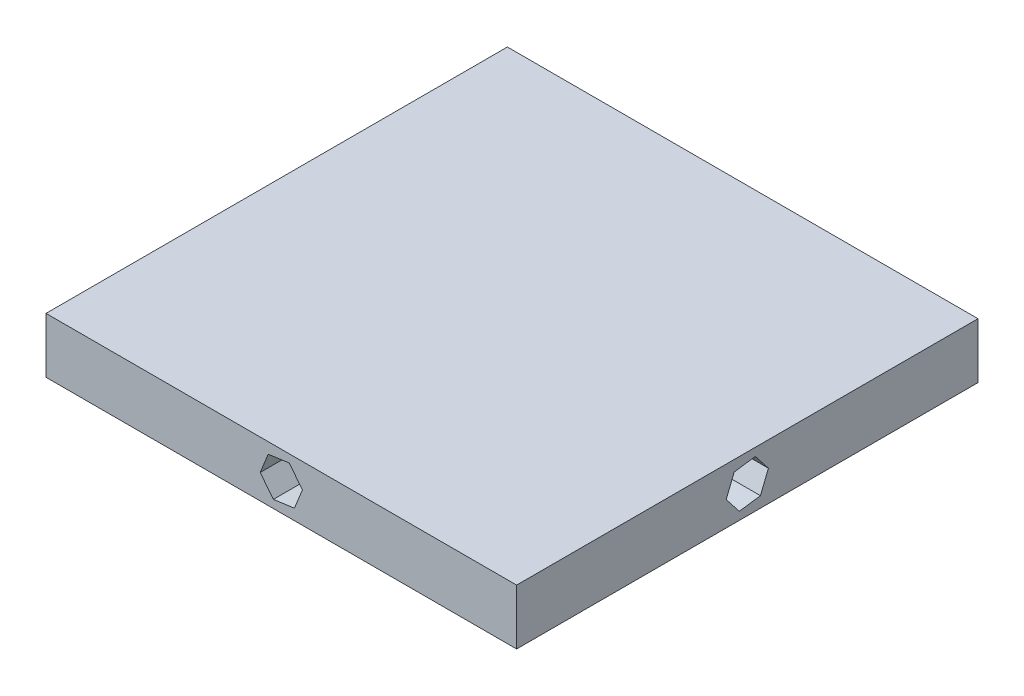
ISO-10303-21;
HEADER;
FILE_DESCRIPTION(('STEP AP214'),'2;1');
FILE_NAME('part.step','',(''),(''),'','','');
FILE_SCHEMA(('AUTOMOTIVE_DESIGN { 1 0 10303 214 1 1 1 1 }'));
ENDSEC;
DATA;
#1=APPLICATION_CONTEXT('core data for automotive mechanical design processes');
#2=APPLICATION_PROTOCOL_DEFINITION('international standard','automotive_design',2000,#1);
#3=PRODUCT_CONTEXT('',#1,'mechanical');
#4=PRODUCT('Part','Part','',(#3));
#5=PRODUCT_RELATED_PRODUCT_CATEGORY('part','',(#4));
#6=PRODUCT_DEFINITION_FORMATION('','',#4);
#7=PRODUCT_DEFINITION_CONTEXT('part definition',#1,'design');
#8=PRODUCT_DEFINITION('design','',#6,#7);
#9=PRODUCT_DEFINITION_SHAPE('','',#8);
#10=(LENGTH_UNIT() NAMED_UNIT(*) SI_UNIT(.MILLI.,.METRE.));
#11=(NAMED_UNIT(*) PLANE_ANGLE_UNIT() SI_UNIT($,.RADIAN.));
#12=(NAMED_UNIT(*) SI_UNIT($,.STERADIAN.) SOLID_ANGLE_UNIT());
#13=UNCERTAINTY_MEASURE_WITH_UNIT(LENGTH_MEASURE(1.E-05),#10,'distance_accuracy_value','');
#14=(GEOMETRIC_REPRESENTATION_CONTEXT(3) GLOBAL_UNCERTAINTY_ASSIGNED_CONTEXT((#13)) GLOBAL_UNIT_ASSIGNED_CONTEXT((#10,
#11,#12)) REPRESENTATION_CONTEXT('',''));
#15=CARTESIAN_POINT('',(0.,0.,0.));
#16=DIRECTION('',(0.,0.,1.));
#17=DIRECTION('',(1.,0.,0.));
#18=AXIS2_PLACEMENT_3D('',#15,#16,#17);
#19=CARTESIAN_POINT('',(-25.5,6.,-25.));
#20=DIRECTION('',(1.,0.,0.));
#21=DIRECTION('',(0.,0.,-1.));
#22=AXIS2_PLACEMENT_3D('',#19,#20,#21);
#23=PLANE('',#22);
#24=DIRECTION('',(0.,0.,1.));
#25=VECTOR('',#24,1.);
#26=CARTESIAN_POINT('',(-25.5,0.,-25.));
#27=LINE('',#26,#25);
#28=CARTESIAN_POINT('',(-25.5,0.,-25.));
#29=VERTEX_POINT('',#28);
#30=CARTESIAN_POINT('',(-25.5,0.,25.));
#31=VERTEX_POINT('',#30);
#32=EDGE_CURVE('E340',#29,#31,#27,.T.);
#33=ORIENTED_EDGE('',*,*,#32,.T.);
#34=DIRECTION('',(0.,-1.,0.));
#35=VECTOR('',#34,1.);
#36=CARTESIAN_POINT('',(-25.5,6.,25.));
#37=LINE('',#36,#35);
#38=CARTESIAN_POINT('',(-25.5,6.,25.));
#39=VERTEX_POINT('',#38);
#40=EDGE_CURVE('E367',#39,#31,#37,.T.);
#41=ORIENTED_EDGE('',*,*,#40,.F.);
#42=DIRECTION('',(0.,0.,1.));
#43=VECTOR('',#42,1.);
#44=CARTESIAN_POINT('',(-25.5,6.,-25.));
#45=LINE('',#44,#43);
#46=CARTESIAN_POINT('',(-25.5,6.,-25.));
#47=VERTEX_POINT('',#46);
#48=EDGE_CURVE('E341',#47,#39,#45,.T.);
#49=ORIENTED_EDGE('',*,*,#48,.F.);
#50=DIRECTION('',(0.,-1.,0.));
#51=VECTOR('',#50,1.);
#52=CARTESIAN_POINT('',(-25.5,6.,-25.));
#53=LINE('',#52,#51);
#54=EDGE_CURVE('E351',#47,#29,#53,.T.);
#55=ORIENTED_EDGE('',*,*,#54,.T.);
#56=EDGE_LOOP('',(#33,#41,#49,#55));
#57=FACE_BOUND('',#56,.T.);
#58=DIRECTION('',(0.,0.927183854566785,0.374606593415919));
#59=VECTOR('',#58,1.);
#60=CARTESIAN_POINT('',(-25.5,-3.85343311706147,-0.611897230944899));
#61=LINE('',#60,#59);
#62=CARTESIAN_POINT('',(-25.5,1.18016711712335,1.42180927403579));
#63=VERTEX_POINT('',#62);
#64=CARTESIAN_POINT('',(-25.5,3.32140650921298,2.28692614423135));
#65=VERTEX_POINT('',#64);
#66=EDGE_CURVE('E11',#63,#65,#61,.T.);
#67=ORIENTED_EDGE('',*,*,#66,.F.);
#68=DIRECTION('',(0.,0.139173100960059,0.990268068741571));
#69=VECTOR('',#68,1.);
#70=CARTESIAN_POINT('',(-25.5,-2.36789562910295,-23.8239689635834));
#71=LINE('',#70,#69);
#72=CARTESIAN_POINT('',(-25.5,0.858760607910368,-0.865116870195554));
#73=VERTEX_POINT('',#72);
#74=EDGE_CURVE('E46',#73,#63,#71,.T.);
#75=ORIENTED_EDGE('',*,*,#74,.F.);
#76=DIRECTION('',(0.,-0.788010753606726,0.615661475325653));
#77=VECTOR('',#76,1.);
#78=CARTESIAN_POINT('',(-25.5,15.7602564711981,-12.5074414016314));
#79=LINE('',#78,#77);
#80=CARTESIAN_POINT('',(-25.5,2.67859349078702,-2.28692614423134));
#81=VERTEX_POINT('',#80);
#82=EDGE_CURVE('E412',#81,#73,#79,.T.);
#83=ORIENTED_EDGE('',*,*,#82,.F.);
#84=DIRECTION('',(0.,-0.927183854566785,-0.374606593415919));
#85=VECTOR('',#84,1.);
#86=CARTESIAN_POINT('',(-25.5,-2.3550067433978,-4.32063264921204));
#87=LINE('',#86,#85);
#88=CARTESIAN_POINT('',(-25.5,4.81983288287665,-1.42180927403579));
#89=VERTEX_POINT('',#88);
#90=EDGE_CURVE('E410',#89,#81,#87,.T.);
#91=ORIENTED_EDGE('',*,*,#90,.F.);
#92=DIRECTION('',(0.,-0.139173100960058,-0.990268068741571));
#93=VECTOR('',#92,1.);
#94=CARTESIAN_POINT('',(-25.5,1.59317664586334,-24.3806613674237));
#95=LINE('',#94,#93);
#96=CARTESIAN_POINT('',(-25.5,5.14123939208963,0.865116870195561));
#97=VERTEX_POINT('',#96);
#98=EDGE_CURVE('E408',#97,#89,#95,.T.);
#99=ORIENTED_EDGE('',*,*,#98,.F.);
#100=DIRECTION('',(0.,0.788010753606727,-0.615661475325653));
#101=VECTOR('',#100,1.);
#102=CARTESIAN_POINT('',(-25.5,18.2229023725007,-9.35539838720451));
#103=LINE('',#102,#101);
#104=EDGE_CURVE('E406',#65,#97,#103,.T.);
#105=ORIENTED_EDGE('',*,*,#104,.F.);
#106=EDGE_LOOP('',(#67,#75,#83,#91,#99,#105));
#107=FACE_BOUND('',#106,.T.);
#108=ADVANCED_FACE('F39',(#57,#107),#23,.F.);
#109=CARTESIAN_POINT('',(25.5,6.,25.));
#110=DIRECTION('',(0.,0.,-1.));
#111=DIRECTION('',(-1.,0.,0.));
#112=AXIS2_PLACEMENT_3D('',#109,#110,#111);
#113=PLANE('',#112);
#114=DIRECTION('',(1.,0.,0.));
#115=VECTOR('',#114,1.);
#116=CARTESIAN_POINT('',(25.5,0.,25.));
#117=LINE('',#116,#115);
#118=CARTESIAN_POINT('',(25.5,0.,25.));
#119=VERTEX_POINT('',#118);
#120=EDGE_CURVE('E354',#31,#119,#117,.T.);
#121=ORIENTED_EDGE('',*,*,#120,.T.);
#122=DIRECTION('',(0.,-1.,0.));
#123=VECTOR('',#122,1.);
#124=CARTESIAN_POINT('',(25.5,6.,25.));
#125=LINE('',#124,#123);
#126=CARTESIAN_POINT('',(25.5,6.,25.));
#127=VERTEX_POINT('',#126);
#128=EDGE_CURVE('E364',#127,#119,#125,.T.);
#129=ORIENTED_EDGE('',*,*,#128,.F.);
#130=DIRECTION('',(1.,0.,0.));
#131=VECTOR('',#130,1.);
#132=CARTESIAN_POINT('',(25.5,6.,25.));
#133=LINE('',#132,#131);
#134=EDGE_CURVE('E344',#39,#127,#133,.T.);
#135=ORIENTED_EDGE('',*,*,#134,.F.);
#136=ORIENTED_EDGE('',*,*,#40,.T.);
#137=EDGE_LOOP('',(#121,#129,#135,#136));
#138=FACE_BOUND('',#137,.T.);
#139=DIRECTION('',(0.374606593415919,0.927183854566785,0.));
#140=VECTOR('',#139,1.);
#141=CARTESIAN_POINT('',(6.47477281050463,13.6866907370284,25.));
#142=LINE('',#141,#140);
#143=CARTESIAN_POINT('',(1.42180927403606,1.18016711712335,25.));
#144=VERTEX_POINT('',#143);
#145=CARTESIAN_POINT('',(2.28692614423161,3.32140650921298,25.));
#146=VERTEX_POINT('',#145);
#147=EDGE_CURVE('E404',#144,#146,#142,.T.);
#148=ORIENTED_EDGE('',*,*,#147,.F.);
#149=DIRECTION('',(0.990268068741571,0.139173100960059,0.));
#150=VECTOR('',#149,1.);
#151=CARTESIAN_POINT('',(25.6978888588592,4.59194760527591,25.));
#152=LINE('',#151,#150);
#153=CARTESIAN_POINT('',(-0.865116870195292,0.858760607910368,25.));
#154=VERTEX_POINT('',#153);
#155=EDGE_CURVE('E402',#154,#144,#152,.T.);
#156=ORIENTED_EDGE('',*,*,#155,.F.);
#157=DIRECTION('',(0.615661475325653,-0.788010753606726,0.));
#158=VECTOR('',#157,1.);
#159=CARTESIAN_POINT('',(6.63403073447678,-8.73971061727057,25.));
#160=LINE('',#159,#158);
#161=CARTESIAN_POINT('',(-2.28692614423108,2.67859349078702,25.));
#162=VERTEX_POINT('',#161);
#163=EDGE_CURVE('E400',#162,#154,#160,.T.);
#164=ORIENTED_EDGE('',*,*,#163,.F.);
#165=DIRECTION('',(-0.374606593415919,-0.927183854566785,0.));
#166=VECTOR('',#165,1.);
#167=CARTESIAN_POINT('',(2.7660373922375,15.1851171106921,25.));
#168=LINE('',#167,#166);
#169=CARTESIAN_POINT('',(-1.42180927403552,4.81983288287665,25.));
#170=VERTEX_POINT('',#169);
#171=EDGE_CURVE('E398',#170,#162,#168,.T.);
#172=ORIENTED_EDGE('',*,*,#171,.F.);
#173=DIRECTION('',(-0.990268068741571,-0.139173100960058,0.));
#174=VECTOR('',#173,1.);
#175=CARTESIAN_POINT('',(25.141196455019,8.55301988024219,25.));
#176=LINE('',#175,#174);
#177=CARTESIAN_POINT('',(0.865116870195823,5.14123939208963,25.));
#178=VERTEX_POINT('',#177);
#179=EDGE_CURVE('E396',#178,#170,#176,.T.);
#180=ORIENTED_EDGE('',*,*,#179,.F.);
#181=DIRECTION('',(-0.615661475325653,0.788010753606727,0.));
#182=VECTOR('',#181,1.);
#183=CARTESIAN_POINT('',(9.78607374890368,-6.27706471596795,25.));
#184=LINE('',#183,#182);
#185=EDGE_CURVE('E394',#146,#178,#184,.T.);
#186=ORIENTED_EDGE('',*,*,#185,.F.);
#187=EDGE_LOOP('',(#148,#156,#164,#172,#180,#186));
#188=FACE_BOUND('',#187,.T.);
#189=ADVANCED_FACE('F452',(#138,#188),#113,.F.);
#190=CARTESIAN_POINT('',(25.5,6.,-25.));
#191=DIRECTION('',(0.,0.,1.));
#192=DIRECTION('',(1.,0.,0.));
#193=AXIS2_PLACEMENT_3D('',#190,#191,#192);
#194=PLANE('',#193);
#195=DIRECTION('',(-1.,0.,0.));
#196=VECTOR('',#195,1.);
#197=CARTESIAN_POINT('',(25.5,0.,-25.));
#198=LINE('',#197,#196);
#199=CARTESIAN_POINT('',(25.5,0.,-25.));
#200=VERTEX_POINT('',#199);
#201=EDGE_CURVE('E345',#200,#29,#198,.T.);
#202=ORIENTED_EDGE('',*,*,#201,.T.);
#203=ORIENTED_EDGE('',*,*,#54,.F.);
#204=DIRECTION('',(-1.,0.,0.));
#205=VECTOR('',#204,1.);
#206=CARTESIAN_POINT('',(25.5,6.,-25.));
#207=LINE('',#206,#205);
#208=CARTESIAN_POINT('',(25.5,6.,-25.));
#209=VERTEX_POINT('',#208);
#210=EDGE_CURVE('E349',#209,#47,#207,.T.);
#211=ORIENTED_EDGE('',*,*,#210,.F.);
#212=DIRECTION('',(0.,-1.,0.));
#213=VECTOR('',#212,1.);
#214=CARTESIAN_POINT('',(25.5,6.,-25.));
#215=LINE('',#214,#213);
#216=EDGE_CURVE('E361',#209,#200,#215,.T.);
#217=ORIENTED_EDGE('',*,*,#216,.T.);
#218=EDGE_LOOP('',(#202,#203,#211,#217));
#219=FACE_BOUND('',#218,.T.);
#220=DIRECTION('',(-0.374606593415919,0.927183854566785,0.));
#221=VECTOR('',#220,1.);
#222=CARTESIAN_POINT('',(0.682062280860169,-4.02709770967625,-25.));
#223=LINE('',#222,#221);
#224=CARTESIAN_POINT('',(-1.42180927403588,1.18016711712335,-25.));
#225=VERTEX_POINT('',#224);
#226=CARTESIAN_POINT('',(-2.28692614423143,3.32140650921298,-25.));
#227=VERTEX_POINT('',#226);
#228=EDGE_CURVE('E392',#225,#227,#223,.T.);
#229=ORIENTED_EDGE('',*,*,#228,.F.);
#230=DIRECTION('',(-0.990268068741571,0.139173100960059,0.));
#231=VECTOR('',#230,1.);
#232=CARTESIAN_POINT('',(24.314284387568,-2.43680496805721,-25.));
#233=LINE('',#232,#231);
#234=CARTESIAN_POINT('',(0.86511687019547,0.858760607910368,-25.));
#235=VERTEX_POINT('',#234);
#236=EDGE_CURVE('E246',#235,#225,#233,.T.);
#237=ORIENTED_EDGE('',*,*,#236,.F.);
#238=DIRECTION('',(-0.615661475325653,-0.788010753606726,0.));
#239=VECTOR('',#238,1.);
#240=CARTESIAN_POINT('',(12.6969609277314,16.0028304027672,-25.));
#241=LINE('',#240,#239);
#242=CARTESIAN_POINT('',(2.28692614423126,2.67859349078702,-25.));
#243=VERTEX_POINT('',#242);
#244=EDGE_CURVE('E389',#243,#235,#241,.T.);
#245=ORIENTED_EDGE('',*,*,#244,.F.);
#246=DIRECTION('',(0.374606593415919,-0.927183854566785,0.));
#247=VECTOR('',#246,1.);
#248=CARTESIAN_POINT('',(4.39079769912731,-2.52867133601258,-25.));
#249=LINE('',#248,#247);
#250=CARTESIAN_POINT('',(1.4218092740357,4.81983288287665,-25.));
#251=VERTEX_POINT('',#250);
#252=EDGE_CURVE('E387',#251,#243,#249,.T.);
#253=ORIENTED_EDGE('',*,*,#252,.F.);
#254=DIRECTION('',(0.990268068741571,-0.139173100960058,0.));
#255=VECTOR('',#254,1.);
#256=CARTESIAN_POINT('',(24.8709767914082,1.52426730690908,-25.));
#257=LINE('',#256,#255);
#258=CARTESIAN_POINT('',(-0.865116870195644,5.14123939208963,-25.));
#259=VERTEX_POINT('',#258);
#260=EDGE_CURVE('E385',#259,#251,#257,.T.);
#261=ORIENTED_EDGE('',*,*,#260,.F.);
#262=DIRECTION('',(0.615661475325653,0.788010753606727,0.));
#263=VECTOR('',#262,1.);
#264=CARTESIAN_POINT('',(9.54491791330454,18.4654763040698,-25.));
#265=LINE('',#264,#263);
#266=EDGE_CURVE('E383',#227,#259,#265,.T.);
#267=ORIENTED_EDGE('',*,*,#266,.F.);
#268=EDGE_LOOP('',(#229,#237,#245,#253,#261,#267));
#269=FACE_BOUND('',#268,.T.);
#270=ADVANCED_FACE('F457',(#219,#269),#194,.F.);
#271=CARTESIAN_POINT('',(25.5,6.,-25.));
#272=DIRECTION('',(-1.,0.,0.));
#273=DIRECTION('',(0.,0.,1.));
#274=AXIS2_PLACEMENT_3D('',#271,#272,#273);
#275=PLANE('',#274);
#276=DIRECTION('',(0.,0.,-1.));
#277=VECTOR('',#276,1.);
#278=CARTESIAN_POINT('',(25.5,0.,-25.));
#279=LINE('',#278,#277);
#280=EDGE_CURVE('E356',#119,#200,#279,.T.);
#281=ORIENTED_EDGE('',*,*,#280,.T.);
#282=ORIENTED_EDGE('',*,*,#216,.F.);
#283=DIRECTION('',(0.,0.,-1.));
#284=VECTOR('',#283,1.);
#285=CARTESIAN_POINT('',(25.5,6.,-25.));
#286=LINE('',#285,#284);
#287=EDGE_CURVE('E347',#127,#209,#286,.T.);
#288=ORIENTED_EDGE('',*,*,#287,.F.);
#289=ORIENTED_EDGE('',*,*,#128,.T.);
#290=EDGE_LOOP('',(#281,#282,#288,#289));
#291=FACE_BOUND('',#290,.T.);
#292=DIRECTION('',(0.,0.927183854566785,-0.374606593415919));
#293=VECTOR('',#292,1.);
#294=CARTESIAN_POINT('',(25.5,13.5130261444137,-6.40460776058906));
#295=LINE('',#294,#293);
#296=CARTESIAN_POINT('',(25.5,1.18016711712335,-1.42180927403579));
#297=VERTEX_POINT('',#296);
#298=CARTESIAN_POINT('',(25.5,3.32140650921298,-2.28692614423135));
#299=VERTEX_POINT('',#298);
#300=EDGE_CURVE('E380',#297,#299,#295,.T.);
#301=ORIENTED_EDGE('',*,*,#300,.F.);
#302=DIRECTION('',(0.,0.139173100960059,-0.990268068741571));
#303=VECTOR('',#302,1.);
#304=CARTESIAN_POINT('',(25.5,4.5230382663217,-25.2075734348746));
#305=LINE('',#304,#303);
#306=CARTESIAN_POINT('',(25.5,0.858760607910368,0.865116870195554));
#307=VERTEX_POINT('',#306);
#308=EDGE_CURVE('E378',#307,#297,#305,.T.);
#309=ORIENTED_EDGE('',*,*,#308,.F.);
#310=DIRECTION('',(0.,-0.788010753606726,-0.615661475325653));
#311=VECTOR('',#310,1.);
#312=CARTESIAN_POINT('',(25.5,-8.49713668570169,-6.44451120837654));
#313=LINE('',#312,#311);
#314=CARTESIAN_POINT('',(25.5,2.67859349078702,2.28692614423134));
#315=VERTEX_POINT('',#314);
#316=EDGE_CURVE('E376',#315,#307,#313,.T.);
#317=ORIENTED_EDGE('',*,*,#316,.F.);
#318=DIRECTION('',(0.,-0.927183854566785,0.374606593415919));
#319=VECTOR('',#318,1.);
#320=CARTESIAN_POINT('',(25.5,15.0114525180774,-2.69587234232193));
#321=LINE('',#320,#319);
#322=CARTESIAN_POINT('',(25.5,4.81983288287665,1.42180927403579));
#323=VERTEX_POINT('',#322);
#324=EDGE_CURVE('E374',#323,#315,#321,.T.);
#325=ORIENTED_EDGE('',*,*,#324,.F.);
#326=DIRECTION('',(0.,-0.139173100960058,0.990268068741571));
#327=VECTOR('',#326,1.);
#328=CARTESIAN_POINT('',(25.5,8.48411054128798,-24.6508810310344));
#329=LINE('',#328,#327);
#330=CARTESIAN_POINT('',(25.5,5.14123939208963,-0.865116870195561));
#331=VERTEX_POINT('',#330);
#332=EDGE_CURVE('E372',#331,#323,#329,.T.);
#333=ORIENTED_EDGE('',*,*,#332,.F.);
#334=DIRECTION('',(0.,0.788010753606727,0.615661475325653));
#335=VECTOR('',#334,1.);
#336=CARTESIAN_POINT('',(25.5,-6.03449078439908,-9.59655422280344));
#337=LINE('',#336,#335);
#338=EDGE_CURVE('E370',#299,#331,#337,.T.);
#339=ORIENTED_EDGE('',*,*,#338,.F.);
#340=EDGE_LOOP('',(#301,#309,#317,#325,#333,#339));
#341=FACE_BOUND('',#340,.T.);
#342=ADVANCED_FACE('F477',(#291,#341),#275,.F.);
#343=CARTESIAN_POINT('',(0.,6.,0.));
#344=DIRECTION('',(0.,-1.,0.));
#345=DIRECTION('',(0.,0.,-1.));
#346=AXIS2_PLACEMENT_3D('',#343,#344,#345);
#347=PLANE('',#346);
#348=ORIENTED_EDGE('',*,*,#48,.T.);
#349=ORIENTED_EDGE('',*,*,#134,.T.);
#350=ORIENTED_EDGE('',*,*,#287,.T.);
#351=ORIENTED_EDGE('',*,*,#210,.T.);
#352=EDGE_LOOP('',(#348,#349,#350,#351));
#353=FACE_BOUND('',#352,.T.);
#354=ADVANCED_FACE('F471',(#353),#347,.F.);
#355=CARTESIAN_POINT('',(0.,0.,0.));
#356=DIRECTION('',(0.,-1.,0.));
#357=DIRECTION('',(0.,0.,-1.));
#358=AXIS2_PLACEMENT_3D('',#355,#356,#357);
#359=PLANE('',#358);
#360=ORIENTED_EDGE('',*,*,#32,.F.);
#361=ORIENTED_EDGE('',*,*,#201,.F.);
#362=ORIENTED_EDGE('',*,*,#280,.F.);
#363=ORIENTED_EDGE('',*,*,#120,.F.);
#364=EDGE_LOOP('',(#360,#361,#362,#363));
#365=FACE_BOUND('',#364,.T.);
#366=ADVANCED_FACE('F465',(#365),#359,.T.);
#367=CARTESIAN_POINT('',(11.5,3.32140650921298,-2.28692614423135));
#368=DIRECTION('',(0.,0.374606593415919,0.927183854566785));
#369=DIRECTION('',(0.,-0.927183854566785,0.374606593415919));
#370=AXIS2_PLACEMENT_3D('',#367,#368,#369);
#371=PLANE('',#370);
#372=ORIENTED_EDGE('',*,*,#300,.T.);
#373=DIRECTION('',(1.,0.,0.));
#374=VECTOR('',#373,1.);
#375=CARTESIAN_POINT('',(11.5,3.32140650921298,-2.28692614423135));
#376=LINE('',#375,#374);
#377=CARTESIAN_POINT('',(11.5,3.32140650921298,-2.28692614423135));
#378=VERTEX_POINT('',#377);
#379=EDGE_CURVE('E323',#378,#299,#376,.T.);
#380=ORIENTED_EDGE('',*,*,#379,.F.);
#381=DIRECTION('',(0.,-0.927183854566785,0.374606593415919));
#382=VECTOR('',#381,1.);
#383=CARTESIAN_POINT('',(11.5,3.32140650921298,-2.28692614423135));
#384=LINE('',#383,#382);
#385=CARTESIAN_POINT('',(11.5,1.18016711712335,-1.42180927403579));
#386=VERTEX_POINT('',#385);
#387=EDGE_CURVE('E247',#378,#386,#384,.T.);
#388=ORIENTED_EDGE('',*,*,#387,.T.);
#389=DIRECTION('',(1.,0.,0.));
#390=VECTOR('',#389,1.);
#391=CARTESIAN_POINT('',(11.5,1.18016711712335,-1.42180927403579));
#392=LINE('',#391,#390);
#393=EDGE_CURVE('E337',#386,#297,#392,.T.);
#394=ORIENTED_EDGE('',*,*,#393,.T.);
#395=EDGE_LOOP('',(#372,#380,#388,#394));
#396=FACE_BOUND('',#395,.T.);
#397=ADVANCED_FACE('F488',(#396),#371,.T.);
#398=CARTESIAN_POINT('',(11.5,1.18016711712335,-1.42180927403579));
#399=DIRECTION('',(0.,0.990268068741571,0.139173100960059));
#400=DIRECTION('',(0.,-0.139173100960059,0.990268068741571));
#401=AXIS2_PLACEMENT_3D('',#398,#399,#400);
#402=PLANE('',#401);
#403=ORIENTED_EDGE('',*,*,#308,.T.);
#404=ORIENTED_EDGE('',*,*,#393,.F.);
#405=DIRECTION('',(0.,-0.139173100960059,0.990268068741571));
#406=VECTOR('',#405,1.);
#407=CARTESIAN_POINT('',(11.5,1.18016711712335,-1.42180927403579));
#408=LINE('',#407,#406);
#409=CARTESIAN_POINT('',(11.5,0.858760607910368,0.865116870195554));
#410=VERTEX_POINT('',#409);
#411=EDGE_CURVE('E251',#386,#410,#408,.T.);
#412=ORIENTED_EDGE('',*,*,#411,.T.);
#413=DIRECTION('',(1.,0.,0.));
#414=VECTOR('',#413,1.);
#415=CARTESIAN_POINT('',(11.5,0.858760607910368,0.865116870195554));
#416=LINE('',#415,#414);
#417=EDGE_CURVE('E334',#410,#307,#416,.T.);
#418=ORIENTED_EDGE('',*,*,#417,.T.);
#419=EDGE_LOOP('',(#403,#404,#412,#418));
#420=FACE_BOUND('',#419,.T.);
#421=ADVANCED_FACE('F492',(#420),#402,.T.);
#422=CARTESIAN_POINT('',(11.5,0.858760607910368,0.865116870195554));
#423=DIRECTION('',(0.,0.615661475325653,-0.788010753606726));
#424=DIRECTION('',(0.,0.788010753606726,0.615661475325653));
#425=AXIS2_PLACEMENT_3D('',#422,#423,#424);
#426=PLANE('',#425);
#427=ORIENTED_EDGE('',*,*,#316,.T.);
#428=ORIENTED_EDGE('',*,*,#417,.F.);
#429=DIRECTION('',(0.,0.788010753606726,0.615661475325653));
#430=VECTOR('',#429,1.);
#431=CARTESIAN_POINT('',(11.5,0.858760607910368,0.865116870195554));
#432=LINE('',#431,#430);
#433=CARTESIAN_POINT('',(11.5,2.67859349078702,2.28692614423135));
#434=VERTEX_POINT('',#433);
#435=EDGE_CURVE('E315',#410,#434,#432,.T.);
#436=ORIENTED_EDGE('',*,*,#435,.T.);
#437=DIRECTION('',(1.,0.,0.));
#438=VECTOR('',#437,1.);
#439=CARTESIAN_POINT('',(11.5,2.67859349078702,2.28692614423135));
#440=LINE('',#439,#438);
#441=EDGE_CURVE('E331',#434,#315,#440,.T.);
#442=ORIENTED_EDGE('',*,*,#441,.T.);
#443=EDGE_LOOP('',(#427,#428,#436,#442));
#444=FACE_BOUND('',#443,.T.);
#445=ADVANCED_FACE('F496',(#444),#426,.T.);
#446=CARTESIAN_POINT('',(11.5,2.67859349078702,2.28692614423135));
#447=DIRECTION('',(0.,-0.374606593415919,-0.927183854566785));
#448=DIRECTION('',(0.,0.927183854566785,-0.374606593415919));
#449=AXIS2_PLACEMENT_3D('',#446,#447,#448);
#450=PLANE('',#449);
#451=ORIENTED_EDGE('',*,*,#324,.T.);
#452=ORIENTED_EDGE('',*,*,#441,.F.);
#453=DIRECTION('',(0.,0.927183854566785,-0.374606593415919));
#454=VECTOR('',#453,1.);
#455=CARTESIAN_POINT('',(11.5,2.67859349078702,2.28692614423135));
#456=LINE('',#455,#454);
#457=CARTESIAN_POINT('',(11.5,4.81983288287665,1.42180927403579));
#458=VERTEX_POINT('',#457);
#459=EDGE_CURVE('E317',#434,#458,#456,.T.);
#460=ORIENTED_EDGE('',*,*,#459,.T.);
#461=DIRECTION('',(1.,0.,0.));
#462=VECTOR('',#461,1.);
#463=CARTESIAN_POINT('',(11.5,4.81983288287665,1.42180927403579));
#464=LINE('',#463,#462);
#465=EDGE_CURVE('E328',#458,#323,#464,.T.);
#466=ORIENTED_EDGE('',*,*,#465,.T.);
#467=EDGE_LOOP('',(#451,#452,#460,#466));
#468=FACE_BOUND('',#467,.T.);
#469=ADVANCED_FACE('F505',(#468),#450,.T.);
#470=CARTESIAN_POINT('',(11.5,4.81983288287665,1.42180927403579));
#471=DIRECTION('',(0.,-0.990268068741571,-0.139173100960058));
#472=DIRECTION('',(0.,0.139173100960058,-0.990268068741571));
#473=AXIS2_PLACEMENT_3D('',#470,#471,#472);
#474=PLANE('',#473);
#475=ORIENTED_EDGE('',*,*,#332,.T.);
#476=ORIENTED_EDGE('',*,*,#465,.F.);
#477=DIRECTION('',(0.,0.139173100960058,-0.990268068741571));
#478=VECTOR('',#477,1.);
#479=CARTESIAN_POINT('',(11.5,4.81983288287665,1.42180927403579));
#480=LINE('',#479,#478);
#481=CARTESIAN_POINT('',(11.5,5.14123939208963,-0.86511687019556));
#482=VERTEX_POINT('',#481);
#483=EDGE_CURVE('E319',#458,#482,#480,.T.);
#484=ORIENTED_EDGE('',*,*,#483,.T.);
#485=DIRECTION('',(1.,0.,0.));
#486=VECTOR('',#485,1.);
#487=CARTESIAN_POINT('',(11.5,5.14123939208963,-0.86511687019556));
#488=LINE('',#487,#486);
#489=EDGE_CURVE('E325',#482,#331,#488,.T.);
#490=ORIENTED_EDGE('',*,*,#489,.T.);
#491=EDGE_LOOP('',(#475,#476,#484,#490));
#492=FACE_BOUND('',#491,.T.);
#493=ADVANCED_FACE('F508',(#492),#474,.T.);
#494=CARTESIAN_POINT('',(11.5,5.14123939208963,-0.86511687019556));
#495=DIRECTION('',(0.,-0.615661475325653,0.788010753606727));
#496=DIRECTION('',(0.,-0.788010753606727,-0.615661475325653));
#497=AXIS2_PLACEMENT_3D('',#494,#495,#496);
#498=PLANE('',#497);
#499=ORIENTED_EDGE('',*,*,#338,.T.);
#500=ORIENTED_EDGE('',*,*,#489,.F.);
#501=DIRECTION('',(0.,-0.788010753606727,-0.615661475325652));
#502=VECTOR('',#501,1.);
#503=CARTESIAN_POINT('',(11.5,5.14123939208963,-0.86511687019556));
#504=LINE('',#503,#502);
#505=EDGE_CURVE('E321',#482,#378,#504,.T.);
#506=ORIENTED_EDGE('',*,*,#505,.T.);
#507=ORIENTED_EDGE('',*,*,#379,.T.);
#508=EDGE_LOOP('',(#499,#500,#506,#507));
#509=FACE_BOUND('',#508,.T.);
#510=ADVANCED_FACE('F511',(#509),#498,.T.);
#511=CARTESIAN_POINT('',(11.5,0.,0.));
#512=DIRECTION('',(-1.,0.,0.));
#513=DIRECTION('',(0.,0.,1.));
#514=AXIS2_PLACEMENT_3D('',#511,#512,#513);
#515=PLANE('',#514);
#516=ORIENTED_EDGE('',*,*,#387,.F.);
#517=ORIENTED_EDGE('',*,*,#505,.F.);
#518=ORIENTED_EDGE('',*,*,#483,.F.);
#519=ORIENTED_EDGE('',*,*,#459,.F.);
#520=ORIENTED_EDGE('',*,*,#435,.F.);
#521=ORIENTED_EDGE('',*,*,#411,.F.);
#522=EDGE_LOOP('',(#516,#517,#518,#519,#520,#521));
#523=FACE_BOUND('',#522,.T.);
#524=ADVANCED_FACE('F500',(#523),#515,.F.);
#525=CARTESIAN_POINT('',(-2.28692614423139,3.32140650921298,-11.5));
#526=DIRECTION('',(0.927183854566785,0.374606593415919,0.));
#527=DIRECTION('',(-0.374606593415919,0.927183854566785,0.));
#528=AXIS2_PLACEMENT_3D('',#525,#526,#527);
#529=PLANE('',#528);
#530=ORIENTED_EDGE('',*,*,#228,.T.);
#531=DIRECTION('',(0.,0.,-1.));
#532=VECTOR('',#531,1.);
#533=CARTESIAN_POINT('',(-2.28692614423139,3.32140650921298,-11.5));
#534=LINE('',#533,#532);
#535=CARTESIAN_POINT('',(-2.28692614423139,3.32140650921298,-11.5));
#536=VERTEX_POINT('',#535);
#537=EDGE_CURVE('E241',#536,#227,#534,.T.);
#538=ORIENTED_EDGE('',*,*,#537,.F.);
#539=DIRECTION('',(0.374606593415919,-0.927183854566785,0.));
#540=VECTOR('',#539,1.);
#541=CARTESIAN_POINT('',(-2.28692614423139,3.32140650921298,-11.5));
#542=LINE('',#541,#540);
#543=CARTESIAN_POINT('',(-1.42180927403583,1.18016711712335,-11.5));
#544=VERTEX_POINT('',#543);
#545=EDGE_CURVE('E226',#536,#544,#542,.T.);
#546=ORIENTED_EDGE('',*,*,#545,.T.);
#547=DIRECTION('',(0.,0.,-1.));
#548=VECTOR('',#547,1.);
#549=CARTESIAN_POINT('',(-1.42180927403583,1.18016711712335,-11.5));
#550=LINE('',#549,#548);
#551=EDGE_CURVE('E239',#544,#225,#550,.T.);
#552=ORIENTED_EDGE('',*,*,#551,.T.);
#553=EDGE_LOOP('',(#530,#538,#546,#552));
#554=FACE_BOUND('',#553,.T.);
#555=ADVANCED_FACE('F238',(#554),#529,.T.);
#556=CARTESIAN_POINT('',(-1.42180927403583,1.18016711712335,-11.5));
#557=DIRECTION('',(0.139173100960059,0.990268068741571,0.));
#558=DIRECTION('',(-0.990268068741571,0.139173100960059,0.));
#559=AXIS2_PLACEMENT_3D('',#556,#557,#558);
#560=PLANE('',#559);
#561=ORIENTED_EDGE('',*,*,#236,.T.);
#562=ORIENTED_EDGE('',*,*,#551,.F.);
#563=DIRECTION('',(0.990268068741571,-0.139173100960059,0.));
#564=VECTOR('',#563,1.);
#565=CARTESIAN_POINT('',(-1.42180927403583,1.18016711712335,-11.5));
#566=LINE('',#565,#564);
#567=CARTESIAN_POINT('',(0.865116870195518,0.858760607910368,-11.5));
#568=VERTEX_POINT('',#567);
#569=EDGE_CURVE('E222',#544,#568,#566,.T.);
#570=ORIENTED_EDGE('',*,*,#569,.T.);
#571=DIRECTION('',(0.,0.,-1.));
#572=VECTOR('',#571,1.);
#573=CARTESIAN_POINT('',(0.865116870195518,0.858760607910368,-11.5));
#574=LINE('',#573,#572);
#575=EDGE_CURVE('E248',#568,#235,#574,.T.);
#576=ORIENTED_EDGE('',*,*,#575,.T.);
#577=EDGE_LOOP('',(#561,#562,#570,#576));
#578=FACE_BOUND('',#577,.T.);
#579=ADVANCED_FACE('F244',(#578),#560,.T.);
#580=CARTESIAN_POINT('',(0.865116870195518,0.858760607910368,-11.5));
#581=DIRECTION('',(-0.788010753606726,0.615661475325653,0.));
#582=DIRECTION('',(-0.615661475325653,-0.788010753606726,0.));
#583=AXIS2_PLACEMENT_3D('',#580,#581,#582);
#584=PLANE('',#583);
#585=ORIENTED_EDGE('',*,*,#244,.T.);
#586=ORIENTED_EDGE('',*,*,#575,.F.);
#587=DIRECTION('',(0.615661475325653,0.788010753606726,0.));
#588=VECTOR('',#587,1.);
#589=CARTESIAN_POINT('',(0.865116870195518,0.858760607910368,-11.5));
#590=LINE('',#589,#588);
#591=CARTESIAN_POINT('',(2.28692614423131,2.67859349078702,-11.5));
#592=VERTEX_POINT('',#591);
#593=EDGE_CURVE('E228',#568,#592,#590,.T.);
#594=ORIENTED_EDGE('',*,*,#593,.T.);
#595=DIRECTION('',(0.,0.,-1.));
#596=VECTOR('',#595,1.);
#597=CARTESIAN_POINT('',(2.28692614423131,2.67859349078702,-11.5));
#598=LINE('',#597,#596);
#599=EDGE_CURVE('E253',#592,#243,#598,.T.);
#600=ORIENTED_EDGE('',*,*,#599,.T.);
#601=EDGE_LOOP('',(#585,#586,#594,#600));
#602=FACE_BOUND('',#601,.T.);
#603=ADVANCED_FACE('F651',(#602),#584,.T.);
#604=CARTESIAN_POINT('',(2.28692614423131,2.67859349078702,-11.5));
#605=DIRECTION('',(-0.927183854566785,-0.374606593415919,0.));
#606=DIRECTION('',(0.374606593415919,-0.927183854566785,0.));
#607=AXIS2_PLACEMENT_3D('',#604,#605,#606);
#608=PLANE('',#607);
#609=ORIENTED_EDGE('',*,*,#252,.T.);
#610=ORIENTED_EDGE('',*,*,#599,.F.);
#611=DIRECTION('',(-0.374606593415919,0.927183854566785,0.));
#612=VECTOR('',#611,1.);
#613=CARTESIAN_POINT('',(2.28692614423131,2.67859349078702,-11.5));
#614=LINE('',#613,#612);
#615=CARTESIAN_POINT('',(1.42180927403575,4.81983288287665,-11.5));
#616=VERTEX_POINT('',#615);
#617=EDGE_CURVE('E894',#592,#616,#614,.T.);
#618=ORIENTED_EDGE('',*,*,#617,.T.);
#619=DIRECTION('',(0.,0.,-1.));
#620=VECTOR('',#619,1.);
#621=CARTESIAN_POINT('',(1.42180927403575,4.81983288287665,-11.5));
#622=LINE('',#621,#620);
#623=EDGE_CURVE('E882',#616,#251,#622,.T.);
#624=ORIENTED_EDGE('',*,*,#623,.T.);
#625=EDGE_LOOP('',(#609,#610,#618,#624));
#626=FACE_BOUND('',#625,.T.);
#627=ADVANCED_FACE('F661',(#626),#608,.T.);
#628=CARTESIAN_POINT('',(1.42180927403575,4.81983288287665,-11.5));
#629=DIRECTION('',(-0.139173100960058,-0.990268068741571,0.));
#630=DIRECTION('',(0.990268068741571,-0.139173100960058,0.));
#631=AXIS2_PLACEMENT_3D('',#628,#629,#630);
#632=PLANE('',#631);
#633=ORIENTED_EDGE('',*,*,#260,.T.);
#634=ORIENTED_EDGE('',*,*,#623,.F.);
#635=DIRECTION('',(-0.990268068741571,0.139173100960058,0.));
#636=VECTOR('',#635,1.);
#637=CARTESIAN_POINT('',(1.42180927403575,4.81983288287665,-11.5));
#638=LINE('',#637,#636);
#639=CARTESIAN_POINT('',(-0.865116870195596,5.14123939208963,-11.5));
#640=VERTEX_POINT('',#639);
#641=EDGE_CURVE('E881',#616,#640,#638,.T.);
#642=ORIENTED_EDGE('',*,*,#641,.T.);
#643=DIRECTION('',(0.,0.,-1.));
#644=VECTOR('',#643,1.);
#645=CARTESIAN_POINT('',(-0.865116870195596,5.14123939208963,-11.5));
#646=LINE('',#645,#644);
#647=EDGE_CURVE('E876',#640,#259,#646,.T.);
#648=ORIENTED_EDGE('',*,*,#647,.T.);
#649=EDGE_LOOP('',(#633,#634,#642,#648));
#650=FACE_BOUND('',#649,.T.);
#651=ADVANCED_FACE('F672',(#650),#632,.T.);
#652=CARTESIAN_POINT('',(-0.865116870195596,5.14123939208963,-11.5));
#653=DIRECTION('',(0.788010753606727,-0.615661475325653,0.));
#654=DIRECTION('',(0.615661475325653,0.788010753606727,0.));
#655=AXIS2_PLACEMENT_3D('',#652,#653,#654);
#656=PLANE('',#655);
#657=ORIENTED_EDGE('',*,*,#266,.T.);
#658=ORIENTED_EDGE('',*,*,#647,.F.);
#659=DIRECTION('',(-0.615661475325652,-0.788010753606727,0.));
#660=VECTOR('',#659,1.);
#661=CARTESIAN_POINT('',(-0.865116870195596,5.14123939208963,-11.5));
#662=LINE('',#661,#660);
#663=EDGE_CURVE('E891',#640,#536,#662,.T.);
#664=ORIENTED_EDGE('',*,*,#663,.T.);
#665=ORIENTED_EDGE('',*,*,#537,.T.);
#666=EDGE_LOOP('',(#657,#658,#664,#665));
#667=FACE_BOUND('',#666,.T.);
#668=ADVANCED_FACE('F683',(#667),#656,.T.);
#669=CARTESIAN_POINT('',(0.,0.,-11.5));
#670=DIRECTION('',(0.,0.,1.));
#671=DIRECTION('',(1.,0.,0.));
#672=AXIS2_PLACEMENT_3D('',#669,#670,#671);
#673=PLANE('',#672);
#674=ORIENTED_EDGE('',*,*,#545,.F.);
#675=ORIENTED_EDGE('',*,*,#663,.F.);
#676=ORIENTED_EDGE('',*,*,#641,.F.);
#677=ORIENTED_EDGE('',*,*,#617,.F.);
#678=ORIENTED_EDGE('',*,*,#593,.F.);
#679=ORIENTED_EDGE('',*,*,#569,.F.);
#680=EDGE_LOOP('',(#674,#675,#676,#677,#678,#679));
#681=FACE_BOUND('',#680,.T.);
#682=ADVANCED_FACE('F224',(#681),#673,.F.);
#683=CARTESIAN_POINT('',(2.28692614423147,3.32140650921298,11.5));
#684=DIRECTION('',(-0.927183854566785,0.374606593415919,0.));
#685=DIRECTION('',(-0.374606593415919,-0.927183854566785,0.));
#686=AXIS2_PLACEMENT_3D('',#683,#684,#685);
#687=PLANE('',#686);
#688=ORIENTED_EDGE('',*,*,#147,.T.);
#689=DIRECTION('',(0.,0.,1.));
#690=VECTOR('',#689,1.);
#691=CARTESIAN_POINT('',(2.28692614423147,3.32140650921298,11.5));
#692=LINE('',#691,#690);
#693=CARTESIAN_POINT('',(2.28692614423147,3.32140650921298,11.5));
#694=VERTEX_POINT('',#693);
#695=EDGE_CURVE('E60',#694,#146,#692,.T.);
#696=ORIENTED_EDGE('',*,*,#695,.F.);
#697=DIRECTION('',(-0.374606593415919,-0.927183854566785,0.));
#698=VECTOR('',#697,1.);
#699=CARTESIAN_POINT('',(2.28692614423147,3.32140650921298,11.5));
#700=LINE('',#699,#698);
#701=CARTESIAN_POINT('',(1.42180927403591,1.18016711712335,11.5));
#702=VERTEX_POINT('',#701);
#703=EDGE_CURVE('E286',#694,#702,#700,.T.);
#704=ORIENTED_EDGE('',*,*,#703,.T.);
#705=DIRECTION('',(0.,0.,1.));
#706=VECTOR('',#705,1.);
#707=CARTESIAN_POINT('',(1.42180927403591,1.18016711712335,11.5));
#708=LINE('',#707,#706);
#709=EDGE_CURVE('E261',#702,#144,#708,.T.);
#710=ORIENTED_EDGE('',*,*,#709,.T.);
#711=EDGE_LOOP('',(#688,#696,#704,#710));
#712=FACE_BOUND('',#711,.T.);
#713=ADVANCED_FACE('F704',(#712),#687,.T.);
#714=CARTESIAN_POINT('',(1.42180927403591,1.18016711712335,11.5));
#715=DIRECTION('',(-0.139173100960059,0.990268068741571,0.));
#716=DIRECTION('',(-0.990268068741571,-0.139173100960059,0.));
#717=AXIS2_PLACEMENT_3D('',#714,#715,#716);
#718=PLANE('',#717);
#719=ORIENTED_EDGE('',*,*,#155,.T.);
#720=ORIENTED_EDGE('',*,*,#709,.F.);
#721=DIRECTION('',(-0.990268068741571,-0.139173100960059,0.));
#722=VECTOR('',#721,1.);
#723=CARTESIAN_POINT('',(1.42180927403591,1.18016711712335,11.5));
#724=LINE('',#723,#722);
#725=CARTESIAN_POINT('',(-0.865116870195434,0.858760607910368,11.5));
#726=VERTEX_POINT('',#725);
#727=EDGE_CURVE('E289',#702,#726,#724,.T.);
#728=ORIENTED_EDGE('',*,*,#727,.T.);
#729=DIRECTION('',(0.,0.,1.));
#730=VECTOR('',#729,1.);
#731=CARTESIAN_POINT('',(-0.865116870195434,0.858760607910368,11.5));
#732=LINE('',#731,#730);
#733=EDGE_CURVE('E309',#726,#154,#732,.T.);
#734=ORIENTED_EDGE('',*,*,#733,.T.);
#735=EDGE_LOOP('',(#719,#720,#728,#734));
#736=FACE_BOUND('',#735,.T.);
#737=ADVANCED_FACE('F714',(#736),#718,.T.);
#738=CARTESIAN_POINT('',(-0.865116870195434,0.858760607910368,11.5));
#739=DIRECTION('',(0.788010753606726,0.615661475325653,0.));
#740=DIRECTION('',(-0.615661475325653,0.788010753606726,0.));
#741=AXIS2_PLACEMENT_3D('',#738,#739,#740);
#742=PLANE('',#741);
#743=ORIENTED_EDGE('',*,*,#163,.T.);
#744=ORIENTED_EDGE('',*,*,#733,.F.);
#745=DIRECTION('',(-0.615661475325653,0.788010753606726,0.));
#746=VECTOR('',#745,1.);
#747=CARTESIAN_POINT('',(-0.865116870195434,0.858760607910368,11.5));
#748=LINE('',#747,#746);
#749=CARTESIAN_POINT('',(-2.28692614423123,2.67859349078702,11.5));
#750=VERTEX_POINT('',#749);
#751=EDGE_CURVE('E291',#726,#750,#748,.T.);
#752=ORIENTED_EDGE('',*,*,#751,.T.);
#753=DIRECTION('',(0.,0.,1.));
#754=VECTOR('',#753,1.);
#755=CARTESIAN_POINT('',(-2.28692614423123,2.67859349078702,11.5));
#756=LINE('',#755,#754);
#757=EDGE_CURVE('E306',#750,#162,#756,.T.);
#758=ORIENTED_EDGE('',*,*,#757,.T.);
#759=EDGE_LOOP('',(#743,#744,#752,#758));
#760=FACE_BOUND('',#759,.T.);
#761=ADVANCED_FACE('F724',(#760),#742,.T.);
#762=CARTESIAN_POINT('',(-2.28692614423123,2.67859349078702,11.5));
#763=DIRECTION('',(0.927183854566785,-0.374606593415919,0.));
#764=DIRECTION('',(0.374606593415919,0.927183854566785,0.));
#765=AXIS2_PLACEMENT_3D('',#762,#763,#764);
#766=PLANE('',#765);
#767=ORIENTED_EDGE('',*,*,#171,.T.);
#768=ORIENTED_EDGE('',*,*,#757,.F.);
#769=DIRECTION('',(0.374606593415919,0.927183854566785,0.));
#770=VECTOR('',#769,1.);
#771=CARTESIAN_POINT('',(-2.28692614423123,2.67859349078702,11.5));
#772=LINE('',#771,#770);
#773=CARTESIAN_POINT('',(-1.42180927403567,4.81983288287665,11.5));
#774=VERTEX_POINT('',#773);
#775=EDGE_CURVE('E293',#750,#774,#772,.T.);
#776=ORIENTED_EDGE('',*,*,#775,.T.);
#777=DIRECTION('',(0.,0.,1.));
#778=VECTOR('',#777,1.);
#779=CARTESIAN_POINT('',(-1.42180927403567,4.81983288287665,11.5));
#780=LINE('',#779,#778);
#781=EDGE_CURVE('E303',#774,#170,#780,.T.);
#782=ORIENTED_EDGE('',*,*,#781,.T.);
#783=EDGE_LOOP('',(#767,#768,#776,#782));
#784=FACE_BOUND('',#783,.T.);
#785=ADVANCED_FACE('F735',(#784),#766,.T.);
#786=CARTESIAN_POINT('',(-1.42180927403567,4.81983288287665,11.5));
#787=DIRECTION('',(0.139173100960058,-0.990268068741571,0.));
#788=DIRECTION('',(0.990268068741571,0.139173100960058,0.));
#789=AXIS2_PLACEMENT_3D('',#786,#787,#788);
#790=PLANE('',#789);
#791=ORIENTED_EDGE('',*,*,#179,.T.);
#792=ORIENTED_EDGE('',*,*,#781,.F.);
#793=DIRECTION('',(0.990268068741571,0.139173100960058,0.));
#794=VECTOR('',#793,1.);
#795=CARTESIAN_POINT('',(-1.42180927403567,4.81983288287665,11.5));
#796=LINE('',#795,#794);
#797=CARTESIAN_POINT('',(0.86511687019568,5.14123939208963,11.5));
#798=VERTEX_POINT('',#797);
#799=EDGE_CURVE('E295',#774,#798,#796,.T.);
#800=ORIENTED_EDGE('',*,*,#799,.T.);
#801=DIRECTION('',(0.,0.,1.));
#802=VECTOR('',#801,1.);
#803=CARTESIAN_POINT('',(0.86511687019568,5.14123939208963,11.5));
#804=LINE('',#803,#802);
#805=EDGE_CURVE('E300',#798,#178,#804,.T.);
#806=ORIENTED_EDGE('',*,*,#805,.T.);
#807=EDGE_LOOP('',(#791,#792,#800,#806));
#808=FACE_BOUND('',#807,.T.);
#809=ADVANCED_FACE('F746',(#808),#790,.T.);
#810=CARTESIAN_POINT('',(0.86511687019568,5.14123939208963,11.5));
#811=DIRECTION('',(-0.788010753606727,-0.615661475325653,0.));
#812=DIRECTION('',(0.615661475325653,-0.788010753606727,0.));
#813=AXIS2_PLACEMENT_3D('',#810,#811,#812);
#814=PLANE('',#813);
#815=ORIENTED_EDGE('',*,*,#185,.T.);
#816=ORIENTED_EDGE('',*,*,#805,.F.);
#817=DIRECTION('',(0.615661475325652,-0.788010753606727,0.));
#818=VECTOR('',#817,1.);
#819=CARTESIAN_POINT('',(0.86511687019568,5.14123939208963,11.5));
#820=LINE('',#819,#818);
#821=EDGE_CURVE('E297',#798,#694,#820,.T.);
#822=ORIENTED_EDGE('',*,*,#821,.T.);
#823=ORIENTED_EDGE('',*,*,#695,.T.);
#824=EDGE_LOOP('',(#815,#816,#822,#823));
#825=FACE_BOUND('',#824,.T.);
#826=ADVANCED_FACE('F757',(#825),#814,.T.);
#827=CARTESIAN_POINT('',(1.19484661043541E-13,0.,11.5));
#828=DIRECTION('',(0.,0.,-1.));
#829=DIRECTION('',(-1.,0.,0.));
#830=AXIS2_PLACEMENT_3D('',#827,#828,#829);
#831=PLANE('',#830);
#832=ORIENTED_EDGE('',*,*,#703,.F.);
#833=ORIENTED_EDGE('',*,*,#821,.F.);
#834=ORIENTED_EDGE('',*,*,#799,.F.);
#835=ORIENTED_EDGE('',*,*,#775,.F.);
#836=ORIENTED_EDGE('',*,*,#751,.F.);
#837=ORIENTED_EDGE('',*,*,#727,.F.);
#838=EDGE_LOOP('',(#832,#833,#834,#835,#836,#837));
#839=FACE_BOUND('',#838,.T.);
#840=ADVANCED_FACE('F768',(#839),#831,.F.);
#841=CARTESIAN_POINT('',(-11.5,3.32140650921298,2.28692614423135));
#842=DIRECTION('',(0.,0.374606593415919,-0.927183854566785));
#843=DIRECTION('',(0.,0.927183854566785,0.374606593415919));
#844=AXIS2_PLACEMENT_3D('',#841,#842,#843);
#845=PLANE('',#844);
#846=ORIENTED_EDGE('',*,*,#66,.T.);
#847=DIRECTION('',(-1.,0.,0.));
#848=VECTOR('',#847,1.);
#849=CARTESIAN_POINT('',(-11.5,3.32140650921298,2.28692614423135));
#850=LINE('',#849,#848);
#851=CARTESIAN_POINT('',(-11.5,3.32140650921298,2.28692614423135));
#852=VERTEX_POINT('',#851);
#853=EDGE_CURVE('E53',#852,#65,#850,.T.);
#854=ORIENTED_EDGE('',*,*,#853,.F.);
#855=DIRECTION('',(0.,-0.927183854566785,-0.374606593415919));
#856=VECTOR('',#855,1.);
#857=CARTESIAN_POINT('',(-11.5,3.32140650921298,2.28692614423135));
#858=LINE('',#857,#856);
#859=CARTESIAN_POINT('',(-11.5,1.18016711712335,1.42180927403579));
#860=VERTEX_POINT('',#859);
#861=EDGE_CURVE('E257',#852,#860,#858,.T.);
#862=ORIENTED_EDGE('',*,*,#861,.T.);
#863=DIRECTION('',(-1.,0.,0.));
#864=VECTOR('',#863,1.);
#865=CARTESIAN_POINT('',(-11.5,1.18016711712335,1.42180927403579));
#866=LINE('',#865,#864);
#867=EDGE_CURVE('E242',#860,#63,#866,.T.);
#868=ORIENTED_EDGE('',*,*,#867,.T.);
#869=EDGE_LOOP('',(#846,#854,#862,#868));
#870=FACE_BOUND('',#869,.T.);
#871=ADVANCED_FACE('F422',(#870),#845,.T.);
#872=CARTESIAN_POINT('',(-11.5,1.18016711712335,1.42180927403579));
#873=DIRECTION('',(0.,0.990268068741571,-0.139173100960059));
#874=DIRECTION('',(0.,0.139173100960059,0.990268068741571));
#875=AXIS2_PLACEMENT_3D('',#872,#873,#874);
#876=PLANE('',#875);
#877=ORIENTED_EDGE('',*,*,#74,.T.);
#878=ORIENTED_EDGE('',*,*,#867,.F.);
#879=DIRECTION('',(0.,-0.139173100960059,-0.990268068741571));
#880=VECTOR('',#879,1.);
#881=CARTESIAN_POINT('',(-11.5,1.18016711712335,1.42180927403579));
#882=LINE('',#881,#880);
#883=CARTESIAN_POINT('',(-11.5,0.858760607910368,-0.865116870195554));
#884=VERTEX_POINT('',#883);
#885=EDGE_CURVE('E260',#860,#884,#882,.T.);
#886=ORIENTED_EDGE('',*,*,#885,.T.);
#887=DIRECTION('',(-1.,0.,0.));
#888=VECTOR('',#887,1.);
#889=CARTESIAN_POINT('',(-11.5,0.858760607910368,-0.865116870195554));
#890=LINE('',#889,#888);
#891=EDGE_CURVE('E281',#884,#73,#890,.T.);
#892=ORIENTED_EDGE('',*,*,#891,.T.);
#893=EDGE_LOOP('',(#877,#878,#886,#892));
#894=FACE_BOUND('',#893,.T.);
#895=ADVANCED_FACE('F416',(#894),#876,.T.);
#896=CARTESIAN_POINT('',(-11.5,0.858760607910368,-0.865116870195554));
#897=DIRECTION('',(0.,0.615661475325653,0.788010753606726));
#898=DIRECTION('',(0.,-0.788010753606726,0.615661475325653));
#899=AXIS2_PLACEMENT_3D('',#896,#897,#898);
#900=PLANE('',#899);
#901=ORIENTED_EDGE('',*,*,#82,.T.);
#902=ORIENTED_EDGE('',*,*,#891,.F.);
#903=DIRECTION('',(0.,0.788010753606726,-0.615661475325653));
#904=VECTOR('',#903,1.);
#905=CARTESIAN_POINT('',(-11.5,0.858760607910368,-0.865116870195554));
#906=LINE('',#905,#904);
#907=CARTESIAN_POINT('',(-11.5,2.67859349078702,-2.28692614423135));
#908=VERTEX_POINT('',#907);
#909=EDGE_CURVE('E263',#884,#908,#906,.T.);
#910=ORIENTED_EDGE('',*,*,#909,.T.);
#911=DIRECTION('',(-1.,0.,0.));
#912=VECTOR('',#911,1.);
#913=CARTESIAN_POINT('',(-11.5,2.67859349078702,-2.28692614423135));
#914=LINE('',#913,#912);
#915=EDGE_CURVE('E278',#908,#81,#914,.T.);
#916=ORIENTED_EDGE('',*,*,#915,.T.);
#917=EDGE_LOOP('',(#901,#902,#910,#916));
#918=FACE_BOUND('',#917,.T.);
#919=ADVANCED_FACE('F439',(#918),#900,.T.);
#920=CARTESIAN_POINT('',(-11.5,2.67859349078702,-2.28692614423135));
#921=DIRECTION('',(0.,-0.374606593415919,0.927183854566785));
#922=DIRECTION('',(0.,-0.927183854566785,-0.374606593415919));
#923=AXIS2_PLACEMENT_3D('',#920,#921,#922);
#924=PLANE('',#923);
#925=ORIENTED_EDGE('',*,*,#90,.T.);
#926=ORIENTED_EDGE('',*,*,#915,.F.);
#927=DIRECTION('',(0.,0.927183854566785,0.374606593415919));
#928=VECTOR('',#927,1.);
#929=CARTESIAN_POINT('',(-11.5,2.67859349078702,-2.28692614423135));
#930=LINE('',#929,#928);
#931=CARTESIAN_POINT('',(-11.5,4.81983288287665,-1.42180927403579));
#932=VERTEX_POINT('',#931);
#933=EDGE_CURVE('E265',#908,#932,#930,.T.);
#934=ORIENTED_EDGE('',*,*,#933,.T.);
#935=DIRECTION('',(-1.,0.,0.));
#936=VECTOR('',#935,1.);
#937=CARTESIAN_POINT('',(-11.5,4.81983288287665,-1.42180927403579));
#938=LINE('',#937,#936);
#939=EDGE_CURVE('E275',#932,#89,#938,.T.);
#940=ORIENTED_EDGE('',*,*,#939,.T.);
#941=EDGE_LOOP('',(#925,#926,#934,#940));
#942=FACE_BOUND('',#941,.T.);
#943=ADVANCED_FACE('F442',(#942),#924,.T.);
#944=CARTESIAN_POINT('',(-11.5,4.81983288287665,-1.42180927403579));
#945=DIRECTION('',(0.,-0.990268068741571,0.139173100960058));
#946=DIRECTION('',(0.,-0.139173100960058,-0.990268068741571));
#947=AXIS2_PLACEMENT_3D('',#944,#945,#946);
#948=PLANE('',#947);
#949=ORIENTED_EDGE('',*,*,#98,.T.);
#950=ORIENTED_EDGE('',*,*,#939,.F.);
#951=DIRECTION('',(0.,0.139173100960058,0.990268068741571));
#952=VECTOR('',#951,1.);
#953=CARTESIAN_POINT('',(-11.5,4.81983288287665,-1.42180927403579));
#954=LINE('',#953,#952);
#955=CARTESIAN_POINT('',(-11.5,5.14123939208963,0.86511687019556));
#956=VERTEX_POINT('',#955);
#957=EDGE_CURVE('E267',#932,#956,#954,.T.);
#958=ORIENTED_EDGE('',*,*,#957,.T.);
#959=DIRECTION('',(-1.,0.,0.));
#960=VECTOR('',#959,1.);
#961=CARTESIAN_POINT('',(-11.5,5.14123939208963,0.86511687019556));
#962=LINE('',#961,#960);
#963=EDGE_CURVE('E272',#956,#97,#962,.T.);
#964=ORIENTED_EDGE('',*,*,#963,.T.);
#965=EDGE_LOOP('',(#949,#950,#958,#964));
#966=FACE_BOUND('',#965,.T.);
#967=ADVANCED_FACE('F431',(#966),#948,.T.);
#968=CARTESIAN_POINT('',(-11.5,5.14123939208963,0.86511687019556));
#969=DIRECTION('',(0.,-0.615661475325653,-0.788010753606727));
#970=DIRECTION('',(0.,0.788010753606727,-0.615661475325653));
#971=AXIS2_PLACEMENT_3D('',#968,#969,#970);
#972=PLANE('',#971);
#973=ORIENTED_EDGE('',*,*,#104,.T.);
#974=ORIENTED_EDGE('',*,*,#963,.F.);
#975=DIRECTION('',(0.,-0.788010753606727,0.615661475325652));
#976=VECTOR('',#975,1.);
#977=CARTESIAN_POINT('',(-11.5,5.14123939208963,0.86511687019556));
#978=LINE('',#977,#976);
#979=EDGE_CURVE('E269',#956,#852,#978,.T.);
#980=ORIENTED_EDGE('',*,*,#979,.T.);
#981=ORIENTED_EDGE('',*,*,#853,.T.);
#982=EDGE_LOOP('',(#973,#974,#980,#981));
#983=FACE_BOUND('',#982,.T.);
#984=ADVANCED_FACE('F428',(#983),#972,.T.);
#985=CARTESIAN_POINT('',(-11.5,0.,0.));
#986=DIRECTION('',(1.,0.,0.));
#987=DIRECTION('',(0.,0.,-1.));
#988=AXIS2_PLACEMENT_3D('',#985,#986,#987);
#989=PLANE('',#988);
#990=ORIENTED_EDGE('',*,*,#861,.F.);
#991=ORIENTED_EDGE('',*,*,#979,.F.);
#992=ORIENTED_EDGE('',*,*,#957,.F.);
#993=ORIENTED_EDGE('',*,*,#933,.F.);
#994=ORIENTED_EDGE('',*,*,#909,.F.);
#995=ORIENTED_EDGE('',*,*,#885,.F.);
#996=EDGE_LOOP('',(#990,#991,#992,#993,#994,#995));
#997=FACE_BOUND('',#996,.T.);
#998=ADVANCED_FACE('F436',(#997),#989,.F.);
#999=CLOSED_SHELL('',(#108,#189,#270,#342,#354,#366,#397,#421,#445,#469,#493,#510,#524,#555,
#579,#603,#627,#651,#668,#682,#713,#737,#761,#785,#809,#826,#840,#871,#895,#919,#943,#967,#984,#998));
#1000=MANIFOLD_SOLID_BREP('B2',#999);
#1001=ADVANCED_BREP_SHAPE_REPRESENTATION('',(#18,#1000),#14);
#1002=SHAPE_DEFINITION_REPRESENTATION(#9,#1001);
ENDSEC;
END-ISO-10303-21;
